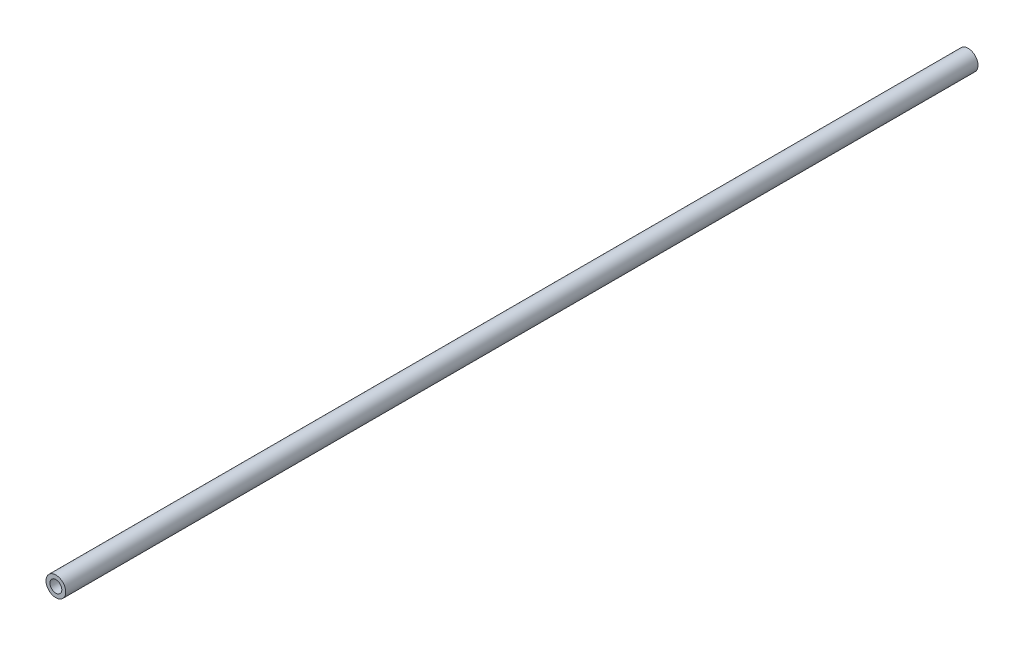
ISO-10303-21;
HEADER;
FILE_DESCRIPTION(('STEP AP214'),'2;1');
FILE_NAME('part.step','',(''),(''),'','','');
FILE_SCHEMA(('AUTOMOTIVE_DESIGN { 1 0 10303 214 1 1 1 1 }'));
ENDSEC;
DATA;
#1=APPLICATION_CONTEXT('core data for automotive mechanical design processes');
#2=APPLICATION_PROTOCOL_DEFINITION('international standard','automotive_design',2000,#1);
#3=PRODUCT_CONTEXT('',#1,'mechanical');
#4=PRODUCT('Part','Part','',(#3));
#5=PRODUCT_RELATED_PRODUCT_CATEGORY('part','',(#4));
#6=PRODUCT_DEFINITION_FORMATION('','',#4);
#7=PRODUCT_DEFINITION_CONTEXT('part definition',#1,'design');
#8=PRODUCT_DEFINITION('design','',#6,#7);
#9=PRODUCT_DEFINITION_SHAPE('','',#8);
#10=(LENGTH_UNIT() NAMED_UNIT(*) SI_UNIT(.MILLI.,.METRE.));
#11=(NAMED_UNIT(*) PLANE_ANGLE_UNIT() SI_UNIT($,.RADIAN.));
#12=(NAMED_UNIT(*) SI_UNIT($,.STERADIAN.) SOLID_ANGLE_UNIT());
#13=UNCERTAINTY_MEASURE_WITH_UNIT(LENGTH_MEASURE(1.E-05),#10,'distance_accuracy_value','');
#14=(GEOMETRIC_REPRESENTATION_CONTEXT(3) GLOBAL_UNCERTAINTY_ASSIGNED_CONTEXT((#13)) GLOBAL_UNIT_ASSIGNED_CONTEXT((#10,
#11,#12)) REPRESENTATION_CONTEXT('',''));
#15=CARTESIAN_POINT('',(0.,0.,0.));
#16=DIRECTION('',(0.,0.,1.));
#17=DIRECTION('',(1.,0.,0.));
#18=AXIS2_PLACEMENT_3D('',#15,#16,#17);
#19=CARTESIAN_POINT('',(0.,0.,462.5));
#20=DIRECTION('',(0.,0.,1.));
#21=DIRECTION('',(1.,0.,0.));
#22=AXIS2_PLACEMENT_3D('',#19,#20,#21);
#23=PLANE('',#22);
#24=CARTESIAN_POINT('',(0.,0.,462.5));
#25=DIRECTION('',(0.,0.,1.));
#26=DIRECTION('',(1.,0.,0.));
#27=AXIS2_PLACEMENT_3D('',#24,#25,#26);
#28=CIRCLE('',#27,5.);
#29=CARTESIAN_POINT('',(-5.,0.,462.5));
#30=VERTEX_POINT('',#29);
#31=EDGE_CURVE('E10',#30,#30,#28,.T.);
#32=ORIENTED_EDGE('',*,*,#31,.T.);
#33=EDGE_LOOP('',(#32));
#34=FACE_BOUND('',#33,.T.);
#35=CARTESIAN_POINT('',(0.,0.,462.5));
#36=DIRECTION('',(0.,0.,1.));
#37=DIRECTION('',(1.,0.,0.));
#38=AXIS2_PLACEMENT_3D('',#35,#36,#37);
#39=CIRCLE('',#38,3.);
#40=CARTESIAN_POINT('',(-3.,0.,462.5));
#41=VERTEX_POINT('',#40);
#42=EDGE_CURVE('E50',#41,#41,#39,.T.);
#43=ORIENTED_EDGE('',*,*,#42,.F.);
#44=EDGE_LOOP('',(#43));
#45=FACE_BOUND('',#44,.T.);
#46=ADVANCED_FACE('F37',(#34,#45),#23,.T.);
#47=CARTESIAN_POINT('',(0.,0.,0.));
#48=DIRECTION('',(0.,0.,1.));
#49=DIRECTION('',(1.,0.,0.));
#50=AXIS2_PLACEMENT_3D('',#47,#48,#49);
#51=PLANE('',#50);
#52=CARTESIAN_POINT('',(0.,0.,0.));
#53=DIRECTION('',(0.,0.,1.));
#54=DIRECTION('',(1.,0.,0.));
#55=AXIS2_PLACEMENT_3D('',#52,#53,#54);
#56=CIRCLE('',#55,5.);
#57=CARTESIAN_POINT('',(-5.,0.,0.));
#58=VERTEX_POINT('',#57);
#59=EDGE_CURVE('E41',#58,#58,#56,.T.);
#60=ORIENTED_EDGE('',*,*,#59,.F.);
#61=EDGE_LOOP('',(#60));
#62=FACE_BOUND('',#61,.T.);
#63=CARTESIAN_POINT('',(0.,0.,0.));
#64=DIRECTION('',(0.,0.,1.));
#65=DIRECTION('',(1.,0.,0.));
#66=AXIS2_PLACEMENT_3D('',#63,#64,#65);
#67=CIRCLE('',#66,3.);
#68=CARTESIAN_POINT('',(-3.,0.,0.));
#69=VERTEX_POINT('',#68);
#70=EDGE_CURVE('E52',#69,#69,#67,.T.);
#71=ORIENTED_EDGE('',*,*,#70,.T.);
#72=EDGE_LOOP('',(#71));
#73=FACE_BOUND('',#72,.T.);
#74=ADVANCED_FACE('F64',(#62,#73),#51,.F.);
#75=CARTESIAN_POINT('',(0.,0.,462.5));
#76=DIRECTION('',(0.,0.,-1.));
#77=DIRECTION('',(-1.,0.,0.));
#78=AXIS2_PLACEMENT_3D('',#75,#76,#77);
#79=CYLINDRICAL_SURFACE('',#78,5.);
#80=CARTESIAN_POINT('',(-5.,0.,462.5));
#81=CARTESIAN_POINT('',(-5.,0.,457.682291666667));
#82=CARTESIAN_POINT('',(-5.,0.,452.864583333333));
#83=CARTESIAN_POINT('',(-5.,0.,443.229166666667));
#84=CARTESIAN_POINT('',(-5.,0.,438.411458333333));
#85=CARTESIAN_POINT('',(-5.,0.,428.776041666667));
#86=CARTESIAN_POINT('',(-5.,0.,423.958333333333));
#87=CARTESIAN_POINT('',(-5.,0.,414.322916666667));
#88=CARTESIAN_POINT('',(-5.,0.,409.505208333333));
#89=CARTESIAN_POINT('',(-5.,0.,399.869791666667));
#90=CARTESIAN_POINT('',(-5.,0.,395.052083333333));
#91=CARTESIAN_POINT('',(-5.,0.,385.416666666667));
#92=CARTESIAN_POINT('',(-5.,0.,380.598958333333));
#93=CARTESIAN_POINT('',(-5.,0.,370.963541666667));
#94=CARTESIAN_POINT('',(-5.,0.,366.145833333333));
#95=CARTESIAN_POINT('',(-5.,0.,356.510416666667));
#96=CARTESIAN_POINT('',(-5.,0.,351.692708333333));
#97=CARTESIAN_POINT('',(-5.,0.,342.057291666667));
#98=CARTESIAN_POINT('',(-5.,0.,337.239583333333));
#99=CARTESIAN_POINT('',(-5.,0.,327.604166666667));
#100=CARTESIAN_POINT('',(-5.,0.,322.786458333333));
#101=CARTESIAN_POINT('',(-5.,0.,313.151041666667));
#102=CARTESIAN_POINT('',(-5.,0.,308.333333333333));
#103=CARTESIAN_POINT('',(-5.,0.,298.697916666667));
#104=CARTESIAN_POINT('',(-5.,0.,293.880208333333));
#105=CARTESIAN_POINT('',(-5.,0.,284.244791666667));
#106=CARTESIAN_POINT('',(-5.,0.,279.427083333333));
#107=CARTESIAN_POINT('',(-5.,0.,269.791666666667));
#108=CARTESIAN_POINT('',(-5.,0.,264.973958333333));
#109=CARTESIAN_POINT('',(-5.,0.,255.338541666667));
#110=CARTESIAN_POINT('',(-5.,0.,250.520833333333));
#111=CARTESIAN_POINT('',(-5.,0.,240.885416666667));
#112=CARTESIAN_POINT('',(-5.,0.,236.067708333333));
#113=CARTESIAN_POINT('',(-5.,0.,226.432291666667));
#114=CARTESIAN_POINT('',(-5.,0.,221.614583333333));
#115=CARTESIAN_POINT('',(-5.,0.,211.979166666667));
#116=CARTESIAN_POINT('',(-5.,0.,207.161458333333));
#117=CARTESIAN_POINT('',(-5.,0.,197.526041666667));
#118=CARTESIAN_POINT('',(-5.,0.,192.708333333333));
#119=CARTESIAN_POINT('',(-5.,0.,183.072916666667));
#120=CARTESIAN_POINT('',(-5.,0.,178.255208333333));
#121=CARTESIAN_POINT('',(-5.,0.,168.619791666667));
#122=CARTESIAN_POINT('',(-5.,0.,163.802083333333));
#123=CARTESIAN_POINT('',(-5.,0.,154.166666666667));
#124=CARTESIAN_POINT('',(-5.,0.,149.348958333333));
#125=CARTESIAN_POINT('',(-5.,0.,139.713541666667));
#126=CARTESIAN_POINT('',(-5.,0.,134.895833333333));
#127=CARTESIAN_POINT('',(-5.,0.,125.260416666667));
#128=CARTESIAN_POINT('',(-5.,0.,120.442708333333));
#129=CARTESIAN_POINT('',(-5.,0.,110.807291666667));
#130=CARTESIAN_POINT('',(-5.,0.,105.989583333333));
#131=CARTESIAN_POINT('',(-5.,0.,96.3541666666666));
#132=CARTESIAN_POINT('',(-5.,0.,91.5364583333333));
#133=CARTESIAN_POINT('',(-5.,0.,81.9010416666666));
#134=CARTESIAN_POINT('',(-5.,0.,77.0833333333333));
#135=CARTESIAN_POINT('',(-5.,0.,67.4479166666666));
#136=CARTESIAN_POINT('',(-5.,0.,62.6302083333333));
#137=CARTESIAN_POINT('',(-5.,0.,52.9947916666667));
#138=CARTESIAN_POINT('',(-5.,0.,48.1770833333333));
#139=CARTESIAN_POINT('',(-5.,0.,38.5416666666666));
#140=CARTESIAN_POINT('',(-5.,0.,33.7239583333333));
#141=CARTESIAN_POINT('',(-5.,0.,24.0885416666666));
#142=CARTESIAN_POINT('',(-5.,0.,19.2708333333333));
#143=CARTESIAN_POINT('',(-5.,0.,9.63541666666662));
#144=CARTESIAN_POINT('',(-5.,0.,4.81770833333328));
#145=CARTESIAN_POINT('',(-5.,0.,0.));
#146=B_SPLINE_CURVE_WITH_KNOTS('',3,(#80,#81,#82,#83,#84,#85,#86,#87,#88,#89,#90,#91,#92,#93,
#94,#95,#96,#97,#98,#99,#100,#101,#102,#103,#104,#105,#106,#107,#108,#109,#110,#111,#112,#113,
#114,#115,#116,#117,#118,#119,#120,#121,#122,#123,#124,#125,#126,#127,#128,#129,#130,#131,#132,
#133,#134,#135,#136,#137,#138,#139,#140,#141,#142,#143,#144,#145),.UNSPECIFIED.,.F.,.F.,(4,2,2,
2,2,2,2,2,2,2,2,2,2,2,2,2,2,2,2,2,2,2,2,2,2,2,2,2,2,2,2,2,4),(0.,14.453125,28.90625,43.359375,
57.8125,72.2656250000001,86.7187500000001,101.171875,115.625,130.078125,144.53125,158.984375,
173.4375,187.890625,202.34375,216.796875,231.25,245.703125,260.15625,274.609375,289.0625,
303.515625,317.96875,332.421875,346.875,361.328125,375.78125,390.234375,404.6875,419.140625,
433.59375,448.046875,462.5),.UNSPECIFIED.);
#147=EDGE_CURVE('BSEAM39',#30,#58,#146,.T.);
#148=ORIENTED_EDGE('',*,*,#31,.F.);
#149=ORIENTED_EDGE('',*,*,#59,.T.);
#150=ORIENTED_EDGE('',*,*,#147,.T.);
#151=ORIENTED_EDGE('',*,*,#147,.F.);
#152=EDGE_LOOP('',(#148,#150,#149,#151));
#153=FACE_BOUND('',#152,.T.);
#154=ADVANCED_FACE('F39',(#153),#79,.T.);
#155=CARTESIAN_POINT('',(0.,0.,462.5));
#156=DIRECTION('',(0.,0.,-1.));
#157=DIRECTION('',(-1.,0.,0.));
#158=AXIS2_PLACEMENT_3D('',#155,#156,#157);
#159=CYLINDRICAL_SURFACE('',#158,3.);
#160=CARTESIAN_POINT('',(-3.,0.,462.5));
#161=CARTESIAN_POINT('',(-3.,0.,457.682291666667));
#162=CARTESIAN_POINT('',(-3.,0.,452.864583333333));
#163=CARTESIAN_POINT('',(-3.,0.,443.229166666667));
#164=CARTESIAN_POINT('',(-3.,0.,438.411458333333));
#165=CARTESIAN_POINT('',(-3.,0.,428.776041666667));
#166=CARTESIAN_POINT('',(-3.,0.,423.958333333333));
#167=CARTESIAN_POINT('',(-3.,0.,414.322916666667));
#168=CARTESIAN_POINT('',(-3.,0.,409.505208333333));
#169=CARTESIAN_POINT('',(-3.,0.,399.869791666667));
#170=CARTESIAN_POINT('',(-3.,0.,395.052083333333));
#171=CARTESIAN_POINT('',(-3.,0.,385.416666666667));
#172=CARTESIAN_POINT('',(-3.,0.,380.598958333333));
#173=CARTESIAN_POINT('',(-3.,0.,370.963541666667));
#174=CARTESIAN_POINT('',(-3.,0.,366.145833333333));
#175=CARTESIAN_POINT('',(-3.,0.,356.510416666667));
#176=CARTESIAN_POINT('',(-3.,0.,351.692708333333));
#177=CARTESIAN_POINT('',(-3.,0.,342.057291666667));
#178=CARTESIAN_POINT('',(-3.,0.,337.239583333333));
#179=CARTESIAN_POINT('',(-3.,0.,327.604166666667));
#180=CARTESIAN_POINT('',(-3.,0.,322.786458333333));
#181=CARTESIAN_POINT('',(-3.,0.,313.151041666667));
#182=CARTESIAN_POINT('',(-3.,0.,308.333333333333));
#183=CARTESIAN_POINT('',(-3.,0.,298.697916666667));
#184=CARTESIAN_POINT('',(-3.,0.,293.880208333333));
#185=CARTESIAN_POINT('',(-3.,0.,284.244791666667));
#186=CARTESIAN_POINT('',(-3.,0.,279.427083333333));
#187=CARTESIAN_POINT('',(-3.,0.,269.791666666667));
#188=CARTESIAN_POINT('',(-3.,0.,264.973958333333));
#189=CARTESIAN_POINT('',(-3.,0.,255.338541666667));
#190=CARTESIAN_POINT('',(-3.,0.,250.520833333333));
#191=CARTESIAN_POINT('',(-3.,0.,240.885416666667));
#192=CARTESIAN_POINT('',(-3.,0.,236.067708333333));
#193=CARTESIAN_POINT('',(-3.,0.,226.432291666667));
#194=CARTESIAN_POINT('',(-3.,0.,221.614583333333));
#195=CARTESIAN_POINT('',(-3.,0.,211.979166666667));
#196=CARTESIAN_POINT('',(-3.,0.,207.161458333333));
#197=CARTESIAN_POINT('',(-3.,0.,197.526041666667));
#198=CARTESIAN_POINT('',(-3.,0.,192.708333333333));
#199=CARTESIAN_POINT('',(-3.,0.,183.072916666667));
#200=CARTESIAN_POINT('',(-3.,0.,178.255208333333));
#201=CARTESIAN_POINT('',(-3.,0.,168.619791666667));
#202=CARTESIAN_POINT('',(-3.,0.,163.802083333333));
#203=CARTESIAN_POINT('',(-3.,0.,154.166666666667));
#204=CARTESIAN_POINT('',(-3.,0.,149.348958333333));
#205=CARTESIAN_POINT('',(-3.,0.,139.713541666667));
#206=CARTESIAN_POINT('',(-3.,0.,134.895833333333));
#207=CARTESIAN_POINT('',(-3.,0.,125.260416666667));
#208=CARTESIAN_POINT('',(-3.,0.,120.442708333333));
#209=CARTESIAN_POINT('',(-3.,0.,110.807291666667));
#210=CARTESIAN_POINT('',(-3.,0.,105.989583333333));
#211=CARTESIAN_POINT('',(-3.,0.,96.3541666666666));
#212=CARTESIAN_POINT('',(-3.,0.,91.5364583333333));
#213=CARTESIAN_POINT('',(-3.,0.,81.9010416666666));
#214=CARTESIAN_POINT('',(-3.,0.,77.0833333333333));
#215=CARTESIAN_POINT('',(-3.,0.,67.4479166666666));
#216=CARTESIAN_POINT('',(-3.,0.,62.6302083333333));
#217=CARTESIAN_POINT('',(-3.,0.,52.9947916666667));
#218=CARTESIAN_POINT('',(-3.,0.,48.1770833333333));
#219=CARTESIAN_POINT('',(-3.,0.,38.5416666666666));
#220=CARTESIAN_POINT('',(-3.,0.,33.7239583333333));
#221=CARTESIAN_POINT('',(-3.,0.,24.0885416666666));
#222=CARTESIAN_POINT('',(-3.,0.,19.2708333333333));
#223=CARTESIAN_POINT('',(-3.,0.,9.63541666666662));
#224=CARTESIAN_POINT('',(-3.,0.,4.81770833333328));
#225=CARTESIAN_POINT('',(-3.,0.,0.));
#226=B_SPLINE_CURVE_WITH_KNOTS('',3,(#160,#161,#162,#163,#164,#165,#166,#167,#168,#169,#170,
#171,#172,#173,#174,#175,#176,#177,#178,#179,#180,#181,#182,#183,#184,#185,#186,#187,#188,#189,
#190,#191,#192,#193,#194,#195,#196,#197,#198,#199,#200,#201,#202,#203,#204,#205,#206,#207,#208,
#209,#210,#211,#212,#213,#214,#215,#216,#217,#218,#219,#220,#221,#222,#223,#224,#225),
.UNSPECIFIED.,.F.,.F.,(4,2,2,2,2,2,2,2,2,2,2,2,2,2,2,2,2,2,2,2,2,2,2,2,2,2,2,2,2,2,2,2,4),(0.,
14.453125,28.90625,43.359375,57.8125,72.2656250000001,86.7187500000001,101.171875,115.625,
130.078125,144.53125,158.984375,173.4375,187.890625,202.34375,216.796875,231.25,245.703125,
260.15625,274.609375,289.0625,303.515625,317.96875,332.421875,346.875,361.328125,375.78125,
390.234375,404.6875,419.140625,433.59375,448.046875,462.5),.UNSPECIFIED.);
#227=EDGE_CURVE('BSEAM60',#41,#69,#226,.T.);
#228=ORIENTED_EDGE('',*,*,#42,.T.);
#229=ORIENTED_EDGE('',*,*,#70,.F.);
#230=ORIENTED_EDGE('',*,*,#227,.T.);
#231=ORIENTED_EDGE('',*,*,#227,.F.);
#232=EDGE_LOOP('',(#228,#230,#229,#231));
#233=FACE_BOUND('',#232,.T.);
#234=ADVANCED_FACE('F60',(#233),#159,.F.);
#235=CLOSED_SHELL('',(#46,#74,#154,#234));
#236=MANIFOLD_SOLID_BREP('B2',#235);
#237=ADVANCED_BREP_SHAPE_REPRESENTATION('',(#18,#236),#14);
#238=SHAPE_DEFINITION_REPRESENTATION(#9,#237);
ENDSEC;
END-ISO-10303-21;
